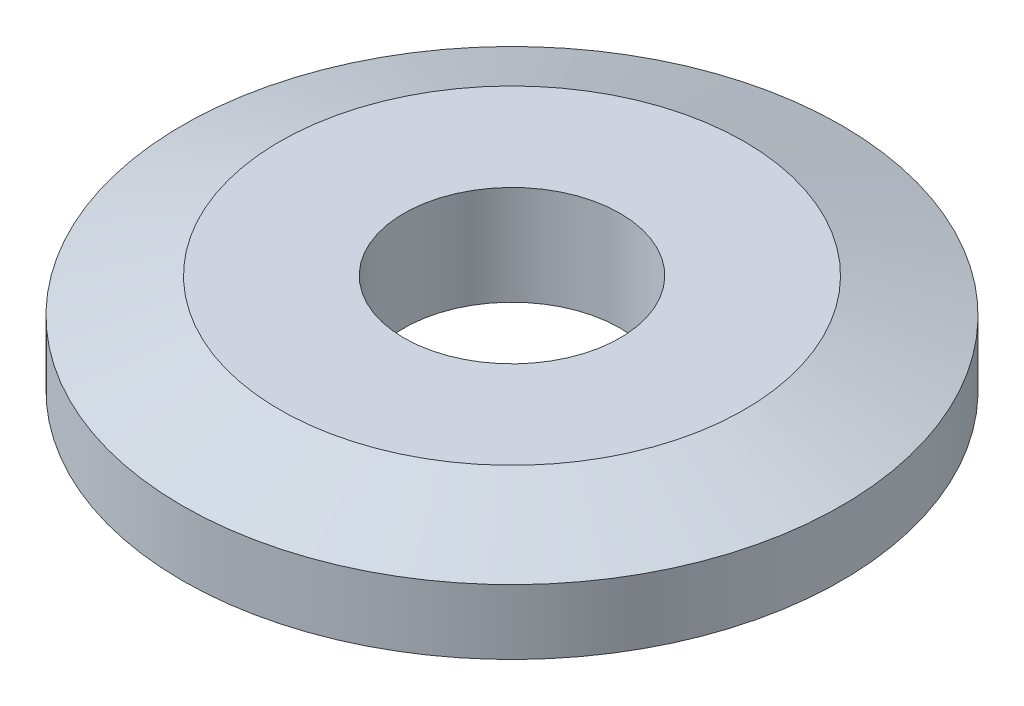
ISO-10303-21;
HEADER;
FILE_DESCRIPTION(('STEP AP214'),'2;1');
FILE_NAME('part.step','',(''),(''),'','','');
FILE_SCHEMA(('AUTOMOTIVE_DESIGN { 1 0 10303 214 1 1 1 1 }'));
ENDSEC;
DATA;
#1=APPLICATION_CONTEXT('core data for automotive mechanical design processes');
#2=APPLICATION_PROTOCOL_DEFINITION('international standard','automotive_design',2000,#1);
#3=PRODUCT_CONTEXT('',#1,'mechanical');
#4=PRODUCT('Part','Part','',(#3));
#5=PRODUCT_RELATED_PRODUCT_CATEGORY('part','',(#4));
#6=PRODUCT_DEFINITION_FORMATION('','',#4);
#7=PRODUCT_DEFINITION_CONTEXT('part definition',#1,'design');
#8=PRODUCT_DEFINITION('design','',#6,#7);
#9=PRODUCT_DEFINITION_SHAPE('','',#8);
#10=(LENGTH_UNIT() NAMED_UNIT(*) SI_UNIT(.MILLI.,.METRE.));
#11=(NAMED_UNIT(*) PLANE_ANGLE_UNIT() SI_UNIT($,.RADIAN.));
#12=(NAMED_UNIT(*) SI_UNIT($,.STERADIAN.) SOLID_ANGLE_UNIT());
#13=UNCERTAINTY_MEASURE_WITH_UNIT(LENGTH_MEASURE(1.E-05),#10,'distance_accuracy_value','');
#14=(GEOMETRIC_REPRESENTATION_CONTEXT(3) GLOBAL_UNCERTAINTY_ASSIGNED_CONTEXT((#13)) GLOBAL_UNIT_ASSIGNED_CONTEXT((#10,
#11,#12)) REPRESENTATION_CONTEXT('',''));
#15=CARTESIAN_POINT('',(0.,0.,0.));
#16=DIRECTION('',(0.,0.,1.));
#17=DIRECTION('',(1.,0.,0.));
#18=AXIS2_PLACEMENT_3D('',#15,#16,#17);
#19=CARTESIAN_POINT('',(7.747,0.,0.));
#20=DIRECTION('',(0.,-1.,0.));
#21=DIRECTION('',(0.,0.,-1.));
#22=AXIS2_PLACEMENT_3D('',#19,#20,#21);
#23=PLANE('',#22);
#24=CARTESIAN_POINT('',(0.,0.,0.));
#25=DIRECTION('',(0.,-1.,0.));
#26=DIRECTION('',(0.,0.,-1.));
#27=AXIS2_PLACEMENT_3D('',#24,#25,#26);
#28=CIRCLE('',#27,7.747);
#29=CARTESIAN_POINT('',(0.,0.,-7.747));
#30=VERTEX_POINT('',#29);
#31=EDGE_CURVE('E50',#30,#30,#28,.T.);
#32=ORIENTED_EDGE('',*,*,#31,.T.);
#33=EDGE_LOOP('',(#32));
#34=FACE_BOUND('',#33,.T.);
#35=CARTESIAN_POINT('',(0.,0.,0.));
#36=DIRECTION('',(0.,-1.,0.));
#37=DIRECTION('',(0.,0.,-1.));
#38=AXIS2_PLACEMENT_3D('',#35,#36,#37);
#39=CIRCLE('',#38,2.54);
#40=CARTESIAN_POINT('',(0.,0.,-2.54));
#41=VERTEX_POINT('',#40);
#42=EDGE_CURVE('E10',#41,#41,#39,.T.);
#43=ORIENTED_EDGE('',*,*,#42,.F.);
#44=EDGE_LOOP('',(#43));
#45=FACE_BOUND('',#44,.T.);
#46=ADVANCED_FACE('F31',(#34,#45),#23,.T.);
#47=CARTESIAN_POINT('',(0.,0.,0.));
#48=DIRECTION('',(0.,-1.,0.));
#49=DIRECTION('',(0.,0.,-1.));
#50=AXIS2_PLACEMENT_3D('',#47,#48,#49);
#51=CYLINDRICAL_SURFACE('',#50,2.54);
#52=ORIENTED_EDGE('',*,*,#42,.T.);
#53=EDGE_LOOP('',(#52));
#54=FACE_BOUND('',#53,.T.);
#55=CARTESIAN_POINT('',(0.,2.3368,0.));
#56=DIRECTION('',(0.,-1.,0.));
#57=DIRECTION('',(0.,0.,-1.));
#58=AXIS2_PLACEMENT_3D('',#55,#56,#57);
#59=CIRCLE('',#58,2.54);
#60=CARTESIAN_POINT('',(0.,2.3368,-2.54));
#61=VERTEX_POINT('',#60);
#62=EDGE_CURVE('E37',#61,#61,#59,.T.);
#63=ORIENTED_EDGE('',*,*,#62,.F.);
#64=EDGE_LOOP('',(#63));
#65=FACE_BOUND('',#64,.T.);
#66=ADVANCED_FACE('F68',(#54,#65),#51,.F.);
#67=CARTESIAN_POINT('',(2.54,2.3368,0.));
#68=DIRECTION('',(0.,1.,0.));
#69=DIRECTION('',(0.,0.,1.));
#70=AXIS2_PLACEMENT_3D('',#67,#68,#69);
#71=PLANE('',#70);
#72=ORIENTED_EDGE('',*,*,#62,.T.);
#73=EDGE_LOOP('',(#72));
#74=FACE_BOUND('',#73,.T.);
#75=CARTESIAN_POINT('',(0.,2.3368,0.));
#76=DIRECTION('',(0.,-1.,0.));
#77=DIRECTION('',(0.,0.,-1.));
#78=AXIS2_PLACEMENT_3D('',#75,#76,#77);
#79=CIRCLE('',#78,5.461);
#80=CARTESIAN_POINT('',(0.,2.3368,-5.461));
#81=VERTEX_POINT('',#80);
#82=EDGE_CURVE('E41',#81,#81,#79,.T.);
#83=ORIENTED_EDGE('',*,*,#82,.F.);
#84=EDGE_LOOP('',(#83));
#85=FACE_BOUND('',#84,.T.);
#86=ADVANCED_FACE('F64',(#74,#85),#71,.T.);
#87=CARTESIAN_POINT('',(0.,1.524,0.));
#88=DIRECTION('',(0.,-1.,0.));
#89=DIRECTION('',(0.,0.,-1.));
#90=AXIS2_PLACEMENT_3D('',#87,#88,#89);
#91=CONICAL_SURFACE('',#90,7.747,1.22918083614709);
#92=ORIENTED_EDGE('',*,*,#82,.T.);
#93=EDGE_LOOP('',(#92));
#94=FACE_BOUND('',#93,.T.);
#95=CARTESIAN_POINT('',(0.,1.524,0.));
#96=DIRECTION('',(0.,-1.,0.));
#97=DIRECTION('',(0.,0.,-1.));
#98=AXIS2_PLACEMENT_3D('',#95,#96,#97);
#99=CIRCLE('',#98,7.747);
#100=CARTESIAN_POINT('',(0.,1.524,-7.747));
#101=VERTEX_POINT('',#100);
#102=EDGE_CURVE('E45',#101,#101,#99,.T.);
#103=ORIENTED_EDGE('',*,*,#102,.F.);
#104=EDGE_LOOP('',(#103));
#105=FACE_BOUND('',#104,.T.);
#106=ADVANCED_FACE('F58',(#94,#105),#91,.T.);
#107=CARTESIAN_POINT('',(0.,0.,0.));
#108=DIRECTION('',(0.,-1.,0.));
#109=DIRECTION('',(0.,0.,-1.));
#110=AXIS2_PLACEMENT_3D('',#107,#108,#109);
#111=CYLINDRICAL_SURFACE('',#110,7.747);
#112=ORIENTED_EDGE('',*,*,#102,.T.);
#113=EDGE_LOOP('',(#112));
#114=FACE_BOUND('',#113,.T.);
#115=ORIENTED_EDGE('',*,*,#31,.F.);
#116=EDGE_LOOP('',(#115));
#117=FACE_BOUND('',#116,.T.);
#118=ADVANCED_FACE('F56',(#114,#117),#111,.T.);
#119=CLOSED_SHELL('',(#46,#66,#86,#106,#118));
#120=MANIFOLD_SOLID_BREP('B2',#119);
#121=ADVANCED_BREP_SHAPE_REPRESENTATION('',(#18,#120),#14);
#122=SHAPE_DEFINITION_REPRESENTATION(#9,#121);
ENDSEC;
END-ISO-10303-21;
